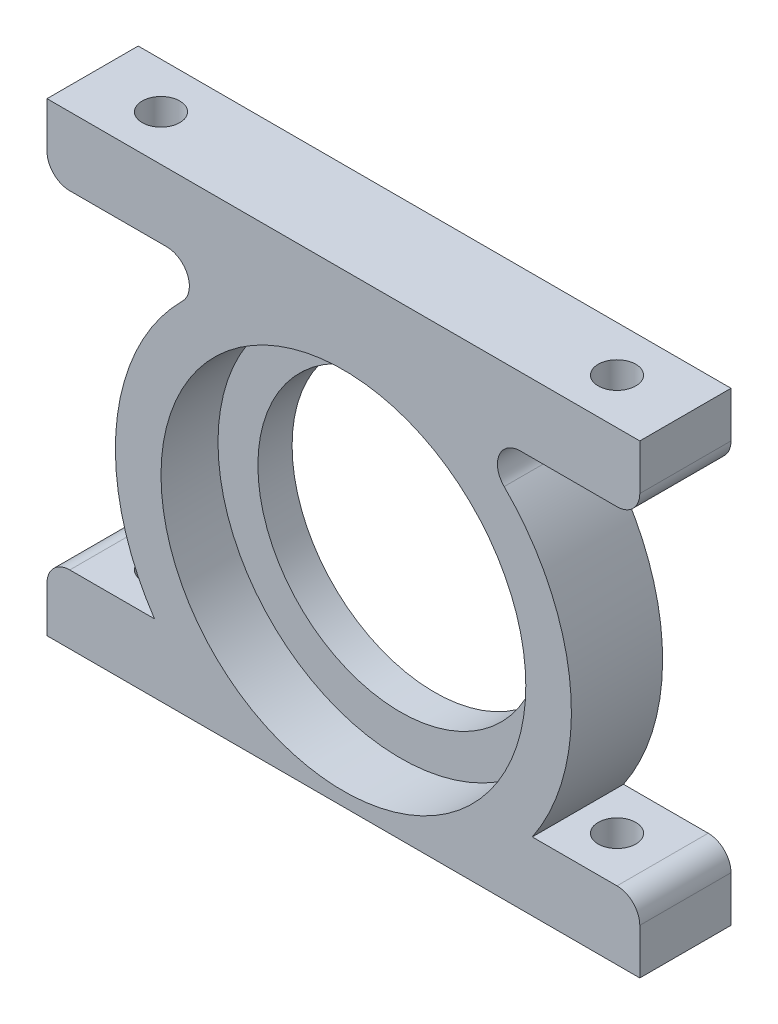
ISO-10303-21;
HEADER;
FILE_DESCRIPTION(('STEP AP214'),'2;1');
FILE_NAME('part.step','',(''),(''),'','','');
FILE_SCHEMA(('AUTOMOTIVE_DESIGN { 1 0 10303 214 1 1 1 1 }'));
ENDSEC;
DATA;
#1=APPLICATION_CONTEXT('core data for automotive mechanical design processes');
#2=APPLICATION_PROTOCOL_DEFINITION('international standard','automotive_design',2000,#1);
#3=PRODUCT_CONTEXT('',#1,'mechanical');
#4=PRODUCT('Part','Part','',(#3));
#5=PRODUCT_RELATED_PRODUCT_CATEGORY('part','',(#4));
#6=PRODUCT_DEFINITION_FORMATION('','',#4);
#7=PRODUCT_DEFINITION_CONTEXT('part definition',#1,'design');
#8=PRODUCT_DEFINITION('design','',#6,#7);
#9=PRODUCT_DEFINITION_SHAPE('','',#8);
#10=(LENGTH_UNIT() NAMED_UNIT(*) SI_UNIT(.MILLI.,.METRE.));
#11=(NAMED_UNIT(*) PLANE_ANGLE_UNIT() SI_UNIT($,.RADIAN.));
#12=(NAMED_UNIT(*) SI_UNIT($,.STERADIAN.) SOLID_ANGLE_UNIT());
#13=UNCERTAINTY_MEASURE_WITH_UNIT(LENGTH_MEASURE(1.E-05),#10,'distance_accuracy_value','');
#14=(GEOMETRIC_REPRESENTATION_CONTEXT(3) GLOBAL_UNCERTAINTY_ASSIGNED_CONTEXT((#13)) GLOBAL_UNIT_ASSIGNED_CONTEXT((#10,
#11,#12)) REPRESENTATION_CONTEXT('',''));
#15=CARTESIAN_POINT('',(0.,0.,0.));
#16=DIRECTION('',(0.,0.,1.));
#17=DIRECTION('',(1.,0.,0.));
#18=AXIS2_PLACEMENT_3D('',#15,#16,#17);
#19=CARTESIAN_POINT('',(-26.,23.6,8.));
#20=DIRECTION('',(0.,-1.,0.));
#21=DIRECTION('',(0.,0.,-1.));
#22=AXIS2_PLACEMENT_3D('',#19,#20,#21);
#23=PLANE('',#22);
#24=DIRECTION('',(-1.,0.,0.));
#25=VECTOR('',#24,1.);
#26=CARTESIAN_POINT('',(-26.,23.6,0.));
#27=LINE('',#26,#25);
#28=CARTESIAN_POINT('',(26.,23.6,0.));
#29=VERTEX_POINT('',#28);
#30=CARTESIAN_POINT('',(-26.,23.6,0.));
#31=VERTEX_POINT('',#30);
#32=EDGE_CURVE('E233',#29,#31,#27,.T.);
#33=ORIENTED_EDGE('',*,*,#32,.T.);
#34=DIRECTION('',(0.,0.,-1.));
#35=VECTOR('',#34,1.);
#36=CARTESIAN_POINT('',(-26.,23.6,8.));
#37=LINE('',#36,#35);
#38=CARTESIAN_POINT('',(-26.,23.6,8.));
#39=VERTEX_POINT('',#38);
#40=EDGE_CURVE('E253',#39,#31,#37,.T.);
#41=ORIENTED_EDGE('',*,*,#40,.F.);
#42=DIRECTION('',(-1.,0.,0.));
#43=VECTOR('',#42,1.);
#44=CARTESIAN_POINT('',(-26.,23.6,8.));
#45=LINE('',#44,#43);
#46=CARTESIAN_POINT('',(26.,23.6,8.));
#47=VERTEX_POINT('',#46);
#48=EDGE_CURVE('E204',#47,#39,#45,.T.);
#49=ORIENTED_EDGE('',*,*,#48,.F.);
#50=DIRECTION('',(0.,0.,-1.));
#51=VECTOR('',#50,1.);
#52=CARTESIAN_POINT('',(26.,23.6,8.));
#53=LINE('',#52,#51);
#54=EDGE_CURVE('E188',#47,#29,#53,.T.);
#55=ORIENTED_EDGE('',*,*,#54,.T.);
#56=EDGE_LOOP('',(#33,#41,#49,#55));
#57=FACE_BOUND('',#56,.T.);
#58=CARTESIAN_POINT('',(20.,23.6,3.99999999999997));
#59=DIRECTION('',(0.,1.,0.));
#60=DIRECTION('',(0.,0.,1.));
#61=AXIS2_PLACEMENT_3D('',#58,#59,#60);
#62=CIRCLE('',#61,1.64999999999999);
#63=CARTESIAN_POINT('',(20.,23.6,5.64999999999995));
#64=VERTEX_POINT('',#63);
#65=EDGE_CURVE('E354',#64,#64,#62,.T.);
#66=ORIENTED_EDGE('',*,*,#65,.F.);
#67=EDGE_LOOP('',(#66));
#68=FACE_BOUND('',#67,.T.);
#69=CARTESIAN_POINT('',(-20.,23.6,4.));
#70=DIRECTION('',(0.,1.,0.));
#71=DIRECTION('',(0.,0.,1.));
#72=AXIS2_PLACEMENT_3D('',#69,#70,#71);
#73=CIRCLE('',#72,1.64999999999999);
#74=CARTESIAN_POINT('',(-20.,23.6,5.64999999999999));
#75=VERTEX_POINT('',#74);
#76=EDGE_CURVE('E363',#75,#75,#73,.T.);
#77=ORIENTED_EDGE('',*,*,#76,.F.);
#78=EDGE_LOOP('',(#77));
#79=FACE_BOUND('',#78,.T.);
#80=ADVANCED_FACE('F37',(#57,#68,#79),#23,.F.);
#81=CARTESIAN_POINT('',(0.,0.,8.));
#82=DIRECTION('',(0.,0.,-1.));
#83=DIRECTION('',(-1.,0.,0.));
#84=AXIS2_PLACEMENT_3D('',#81,#82,#83);
#85=CYLINDRICAL_SURFACE('',#84,16.);
#86=CARTESIAN_POINT('',(0.,0.,8.));
#87=DIRECTION('',(0.,0.,1.));
#88=DIRECTION('',(1.,0.,0.));
#89=AXIS2_PLACEMENT_3D('',#86,#87,#88);
#90=CIRCLE('',#89,16.);
#91=CARTESIAN_POINT('',(16.,0.,8.));
#92=VERTEX_POINT('',#91);
#93=EDGE_CURVE('E225',#92,#92,#90,.T.);
#94=ORIENTED_EDGE('',*,*,#93,.T.);
#95=EDGE_LOOP('',(#94));
#96=FACE_BOUND('',#95,.T.);
#97=CARTESIAN_POINT('',(0.,0.,3.));
#98=DIRECTION('',(0.,0.,-1.));
#99=DIRECTION('',(-1.,0.,0.));
#100=AXIS2_PLACEMENT_3D('',#97,#98,#99);
#101=CIRCLE('',#100,16.);
#102=CARTESIAN_POINT('',(-16.,0.,3.));
#103=VERTEX_POINT('',#102);
#104=EDGE_CURVE('E344',#103,#103,#101,.T.);
#105=ORIENTED_EDGE('',*,*,#104,.T.);
#106=EDGE_LOOP('',(#105));
#107=FACE_BOUND('',#106,.T.);
#108=ADVANCED_FACE('F405',(#96,#107),#85,.F.);
#109=CARTESIAN_POINT('',(0.,0.,8.));
#110=DIRECTION('',(0.,0.,1.));
#111=DIRECTION('',(1.,0.,0.));
#112=AXIS2_PLACEMENT_3D('',#109,#110,#111);
#113=PLANE('',#112);
#114=DIRECTION('',(1.,0.,0.));
#115=VECTOR('',#114,1.);
#116=CARTESIAN_POINT('',(26.,17.6,8.));
#117=LINE('',#116,#115);
#118=CARTESIAN_POINT('',(15.5125755437322,17.6,8.));
#119=VERTEX_POINT('',#118);
#120=CARTESIAN_POINT('',(24.,17.6,8.));
#121=VERTEX_POINT('',#120);
#122=EDGE_CURVE('E193',#119,#121,#117,.T.);
#123=ORIENTED_EDGE('',*,*,#122,.T.);
#124=CARTESIAN_POINT('',(24.,19.6,8.));
#125=DIRECTION('',(0.,0.,1.));
#126=DIRECTION('',(1.,0.,0.));
#127=AXIS2_PLACEMENT_3D('',#124,#125,#126);
#128=CIRCLE('',#127,2.);
#129=CARTESIAN_POINT('',(26.,19.6,8.));
#130=VERTEX_POINT('',#129);
#131=EDGE_CURVE('E276',#121,#130,#128,.T.);
#132=ORIENTED_EDGE('',*,*,#131,.T.);
#133=DIRECTION('',(0.,1.,0.));
#134=VECTOR('',#133,1.);
#135=CARTESIAN_POINT('',(26.,23.6,8.));
#136=LINE('',#135,#134);
#137=EDGE_CURVE('E200',#130,#47,#136,.T.);
#138=ORIENTED_EDGE('',*,*,#137,.T.);
#139=ORIENTED_EDGE('',*,*,#48,.T.);
#140=DIRECTION('',(0.,-1.,0.));
#141=VECTOR('',#140,1.);
#142=CARTESIAN_POINT('',(-26.,23.6,8.));
#143=LINE('',#142,#141);
#144=CARTESIAN_POINT('',(-26.,19.6,8.));
#145=VERTEX_POINT('',#144);
#146=EDGE_CURVE('E201',#39,#145,#143,.T.);
#147=ORIENTED_EDGE('',*,*,#146,.T.);
#148=CARTESIAN_POINT('',(-24.,19.6,8.));
#149=DIRECTION('',(0.,0.,1.));
#150=DIRECTION('',(1.,0.,0.));
#151=AXIS2_PLACEMENT_3D('',#148,#149,#150);
#152=CIRCLE('',#151,2.);
#153=CARTESIAN_POINT('',(-24.,17.6,8.));
#154=VERTEX_POINT('',#153);
#155=EDGE_CURVE('E280',#145,#154,#152,.T.);
#156=ORIENTED_EDGE('',*,*,#155,.T.);
#157=DIRECTION('',(1.,0.,0.));
#158=VECTOR('',#157,1.);
#159=CARTESIAN_POINT('',(-26.,17.6,8.));
#160=LINE('',#159,#158);
#161=CARTESIAN_POINT('',(-15.5125755437322,17.6,8.));
#162=VERTEX_POINT('',#161);
#163=EDGE_CURVE('E210',#154,#162,#160,.T.);
#164=ORIENTED_EDGE('',*,*,#163,.T.);
#165=CARTESIAN_POINT('',(-15.5125755437322,15.6,8.));
#166=DIRECTION('',(0.,0.,1.));
#167=DIRECTION('',(1.,0.,0.));
#168=AXIS2_PLACEMENT_3D('',#165,#166,#167);
#169=CIRCLE('',#168,2.);
#170=CARTESIAN_POINT('',(-14.102341403393,14.1818181818182,8.));
#171=VERTEX_POINT('',#170);
#172=EDGE_CURVE('E11',#162,#171,#169,.F.);
#173=ORIENTED_EDGE('',*,*,#172,.T.);
#174=CARTESIAN_POINT('',(0.,0.,8.));
#175=DIRECTION('',(0.,0.,1.));
#176=DIRECTION('',(1.,0.,0.));
#177=AXIS2_PLACEMENT_3D('',#174,#175,#176);
#178=CIRCLE('',#177,20.);
#179=CARTESIAN_POINT('',(-16.5698521417664,-11.2,8.));
#180=VERTEX_POINT('',#179);
#181=EDGE_CURVE('E208',#171,#180,#178,.T.);
#182=ORIENTED_EDGE('',*,*,#181,.T.);
#183=DIRECTION('',(-1.,0.,0.));
#184=VECTOR('',#183,1.);
#185=CARTESIAN_POINT('',(-26.,-11.2,8.));
#186=LINE('',#185,#184);
#187=CARTESIAN_POINT('',(-24.,-11.2,8.));
#188=VERTEX_POINT('',#187);
#189=EDGE_CURVE('E215',#180,#188,#186,.T.);
#190=ORIENTED_EDGE('',*,*,#189,.T.);
#191=CARTESIAN_POINT('',(-24.,-13.2,8.));
#192=DIRECTION('',(0.,0.,1.));
#193=DIRECTION('',(1.,0.,0.));
#194=AXIS2_PLACEMENT_3D('',#191,#192,#193);
#195=CIRCLE('',#194,2.);
#196=CARTESIAN_POINT('',(-26.,-13.2,8.));
#197=VERTEX_POINT('',#196);
#198=EDGE_CURVE('E54',#188,#197,#195,.T.);
#199=ORIENTED_EDGE('',*,*,#198,.T.);
#200=DIRECTION('',(0.,-1.,0.));
#201=VECTOR('',#200,1.);
#202=CARTESIAN_POINT('',(-26.,-17.2,8.));
#203=LINE('',#202,#201);
#204=CARTESIAN_POINT('',(-26.,-17.2,8.));
#205=VERTEX_POINT('',#204);
#206=EDGE_CURVE('E211',#197,#205,#203,.T.);
#207=ORIENTED_EDGE('',*,*,#206,.T.);
#208=DIRECTION('',(1.,0.,0.));
#209=VECTOR('',#208,1.);
#210=CARTESIAN_POINT('',(-26.,-17.2,8.));
#211=LINE('',#210,#209);
#212=CARTESIAN_POINT('',(26.,-17.2,8.));
#213=VERTEX_POINT('',#212);
#214=EDGE_CURVE('E217',#205,#213,#211,.T.);
#215=ORIENTED_EDGE('',*,*,#214,.T.);
#216=DIRECTION('',(0.,1.,0.));
#217=VECTOR('',#216,1.);
#218=CARTESIAN_POINT('',(26.,-17.2,8.));
#219=LINE('',#218,#217);
#220=CARTESIAN_POINT('',(26.,-13.2,8.));
#221=VERTEX_POINT('',#220);
#222=EDGE_CURVE('E177',#213,#221,#219,.T.);
#223=ORIENTED_EDGE('',*,*,#222,.T.);
#224=CARTESIAN_POINT('',(24.,-13.2,8.));
#225=DIRECTION('',(0.,0.,1.));
#226=DIRECTION('',(1.,0.,0.));
#227=AXIS2_PLACEMENT_3D('',#224,#225,#226);
#228=CIRCLE('',#227,2.);
#229=CARTESIAN_POINT('',(24.,-11.2,8.));
#230=VERTEX_POINT('',#229);
#231=EDGE_CURVE('E174',#221,#230,#228,.T.);
#232=ORIENTED_EDGE('',*,*,#231,.T.);
#233=DIRECTION('',(-1.,0.,0.));
#234=VECTOR('',#233,1.);
#235=CARTESIAN_POINT('',(26.,-11.2,8.));
#236=LINE('',#235,#234);
#237=CARTESIAN_POINT('',(16.5698521417664,-11.2,8.));
#238=VERTEX_POINT('',#237);
#239=EDGE_CURVE('E164',#230,#238,#236,.T.);
#240=ORIENTED_EDGE('',*,*,#239,.T.);
#241=CARTESIAN_POINT('',(0.,0.,8.));
#242=DIRECTION('',(0.,0.,1.));
#243=DIRECTION('',(1.,0.,0.));
#244=AXIS2_PLACEMENT_3D('',#241,#242,#243);
#245=CIRCLE('',#244,20.);
#246=CARTESIAN_POINT('',(14.102341403393,14.1818181818182,8.));
#247=VERTEX_POINT('',#246);
#248=EDGE_CURVE('E171',#238,#247,#245,.T.);
#249=ORIENTED_EDGE('',*,*,#248,.T.);
#250=CARTESIAN_POINT('',(15.5125755437322,15.6,8.));
#251=DIRECTION('',(0.,0.,1.));
#252=DIRECTION('',(1.,0.,0.));
#253=AXIS2_PLACEMENT_3D('',#250,#251,#252);
#254=CIRCLE('',#253,2.);
#255=EDGE_CURVE('E305',#247,#119,#254,.F.);
#256=ORIENTED_EDGE('',*,*,#255,.T.);
#257=EDGE_LOOP('',(#123,#132,#138,#139,#147,#156,#164,#173,#182,#190,#199,#207,#215,#223,#232,
#240,#249,#256));
#258=FACE_BOUND('',#257,.T.);
#259=ORIENTED_EDGE('',*,*,#93,.F.);
#260=EDGE_LOOP('',(#259));
#261=FACE_BOUND('',#260,.T.);
#262=ADVANCED_FACE('F166',(#258,#261),#113,.T.);
#263=CARTESIAN_POINT('',(0.,0.,0.));
#264=DIRECTION('',(0.,0.,1.));
#265=DIRECTION('',(1.,0.,0.));
#266=AXIS2_PLACEMENT_3D('',#263,#264,#265);
#267=PLANE('',#266);
#268=DIRECTION('',(0.,1.,0.));
#269=VECTOR('',#268,1.);
#270=CARTESIAN_POINT('',(26.,23.6,0.));
#271=LINE('',#270,#269);
#272=CARTESIAN_POINT('',(26.,19.6,0.));
#273=VERTEX_POINT('',#272);
#274=EDGE_CURVE('E230',#273,#29,#271,.T.);
#275=ORIENTED_EDGE('',*,*,#274,.F.);
#276=CARTESIAN_POINT('',(24.,19.6,0.));
#277=DIRECTION('',(0.,0.,1.));
#278=DIRECTION('',(1.,0.,0.));
#279=AXIS2_PLACEMENT_3D('',#276,#277,#278);
#280=CIRCLE('',#279,2.);
#281=CARTESIAN_POINT('',(24.,17.6,0.));
#282=VERTEX_POINT('',#281);
#283=EDGE_CURVE('E270',#273,#282,#280,.F.);
#284=ORIENTED_EDGE('',*,*,#283,.T.);
#285=DIRECTION('',(1.,0.,0.));
#286=VECTOR('',#285,1.);
#287=CARTESIAN_POINT('',(26.,17.6,0.));
#288=LINE('',#287,#286);
#289=CARTESIAN_POINT('',(15.5125755437322,17.6,0.));
#290=VERTEX_POINT('',#289);
#291=EDGE_CURVE('E228',#290,#282,#288,.T.);
#292=ORIENTED_EDGE('',*,*,#291,.F.);
#293=CARTESIAN_POINT('',(15.5125755437322,15.6,0.));
#294=DIRECTION('',(0.,0.,1.));
#295=DIRECTION('',(1.,0.,0.));
#296=AXIS2_PLACEMENT_3D('',#293,#294,#295);
#297=CIRCLE('',#296,2.);
#298=CARTESIAN_POINT('',(14.102341403393,14.1818181818182,0.));
#299=VERTEX_POINT('',#298);
#300=EDGE_CURVE('E297',#290,#299,#297,.T.);
#301=ORIENTED_EDGE('',*,*,#300,.T.);
#302=CARTESIAN_POINT('',(0.,0.,0.));
#303=DIRECTION('',(0.,0.,1.));
#304=DIRECTION('',(1.,0.,0.));
#305=AXIS2_PLACEMENT_3D('',#302,#303,#304);
#306=CIRCLE('',#305,20.);
#307=CARTESIAN_POINT('',(16.5698521417664,-11.2,0.));
#308=VERTEX_POINT('',#307);
#309=EDGE_CURVE('E222',#308,#299,#306,.T.);
#310=ORIENTED_EDGE('',*,*,#309,.F.);
#311=DIRECTION('',(-1.,0.,0.));
#312=VECTOR('',#311,1.);
#313=CARTESIAN_POINT('',(26.,-11.2,0.));
#314=LINE('',#313,#312);
#315=CARTESIAN_POINT('',(24.,-11.2,0.));
#316=VERTEX_POINT('',#315);
#317=EDGE_CURVE('E184',#316,#308,#314,.T.);
#318=ORIENTED_EDGE('',*,*,#317,.F.);
#319=CARTESIAN_POINT('',(24.,-13.2,0.));
#320=DIRECTION('',(0.,0.,1.));
#321=DIRECTION('',(1.,0.,0.));
#322=AXIS2_PLACEMENT_3D('',#319,#320,#321);
#323=CIRCLE('',#322,2.);
#324=CARTESIAN_POINT('',(26.,-13.2,0.));
#325=VERTEX_POINT('',#324);
#326=EDGE_CURVE('E265',#316,#325,#323,.F.);
#327=ORIENTED_EDGE('',*,*,#326,.T.);
#328=DIRECTION('',(0.,1.,0.));
#329=VECTOR('',#328,1.);
#330=CARTESIAN_POINT('',(26.,-17.2,0.));
#331=LINE('',#330,#329);
#332=CARTESIAN_POINT('',(26.,-17.2,0.));
#333=VERTEX_POINT('',#332);
#334=EDGE_CURVE('E216',#333,#325,#331,.T.);
#335=ORIENTED_EDGE('',*,*,#334,.F.);
#336=DIRECTION('',(1.,0.,0.));
#337=VECTOR('',#336,1.);
#338=CARTESIAN_POINT('',(-26.,-17.2,0.));
#339=LINE('',#338,#337);
#340=CARTESIAN_POINT('',(-26.,-17.2,0.));
#341=VERTEX_POINT('',#340);
#342=EDGE_CURVE('E244',#341,#333,#339,.T.);
#343=ORIENTED_EDGE('',*,*,#342,.F.);
#344=DIRECTION('',(0.,-1.,0.));
#345=VECTOR('',#344,1.);
#346=CARTESIAN_POINT('',(-26.,-17.2,0.));
#347=LINE('',#346,#345);
#348=CARTESIAN_POINT('',(-26.,-13.2,0.));
#349=VERTEX_POINT('',#348);
#350=EDGE_CURVE('E243',#349,#341,#347,.T.);
#351=ORIENTED_EDGE('',*,*,#350,.F.);
#352=CARTESIAN_POINT('',(-24.,-13.2,0.));
#353=DIRECTION('',(0.,0.,1.));
#354=DIRECTION('',(1.,0.,0.));
#355=AXIS2_PLACEMENT_3D('',#352,#353,#354);
#356=CIRCLE('',#355,2.);
#357=CARTESIAN_POINT('',(-24.,-11.2,0.));
#358=VERTEX_POINT('',#357);
#359=EDGE_CURVE('E262',#349,#358,#356,.F.);
#360=ORIENTED_EDGE('',*,*,#359,.T.);
#361=DIRECTION('',(-1.,0.,0.));
#362=VECTOR('',#361,1.);
#363=CARTESIAN_POINT('',(-26.,-11.2,0.));
#364=LINE('',#363,#362);
#365=CARTESIAN_POINT('',(-16.5698521417664,-11.2,0.));
#366=VERTEX_POINT('',#365);
#367=EDGE_CURVE('E241',#366,#358,#364,.T.);
#368=ORIENTED_EDGE('',*,*,#367,.F.);
#369=CARTESIAN_POINT('',(0.,0.,0.));
#370=DIRECTION('',(0.,0.,1.));
#371=DIRECTION('',(1.,0.,0.));
#372=AXIS2_PLACEMENT_3D('',#369,#370,#371);
#373=CIRCLE('',#372,20.);
#374=CARTESIAN_POINT('',(-14.102341403393,14.1818181818182,0.));
#375=VERTEX_POINT('',#374);
#376=EDGE_CURVE('E237',#375,#366,#373,.T.);
#377=ORIENTED_EDGE('',*,*,#376,.F.);
#378=CARTESIAN_POINT('',(-15.5125755437322,15.6,0.));
#379=DIRECTION('',(0.,0.,1.));
#380=DIRECTION('',(1.,0.,0.));
#381=AXIS2_PLACEMENT_3D('',#378,#379,#380);
#382=CIRCLE('',#381,2.);
#383=CARTESIAN_POINT('',(-15.5125755437322,17.6,0.));
#384=VERTEX_POINT('',#383);
#385=EDGE_CURVE('E48',#375,#384,#382,.T.);
#386=ORIENTED_EDGE('',*,*,#385,.T.);
#387=DIRECTION('',(1.,0.,0.));
#388=VECTOR('',#387,1.);
#389=CARTESIAN_POINT('',(-26.,17.6,0.));
#390=LINE('',#389,#388);
#391=CARTESIAN_POINT('',(-24.,17.6,0.));
#392=VERTEX_POINT('',#391);
#393=EDGE_CURVE('E236',#392,#384,#390,.T.);
#394=ORIENTED_EDGE('',*,*,#393,.F.);
#395=CARTESIAN_POINT('',(-24.,19.6,0.));
#396=DIRECTION('',(0.,0.,1.));
#397=DIRECTION('',(1.,0.,0.));
#398=AXIS2_PLACEMENT_3D('',#395,#396,#397);
#399=CIRCLE('',#398,2.);
#400=CARTESIAN_POINT('',(-26.,19.6,0.));
#401=VERTEX_POINT('',#400);
#402=EDGE_CURVE('E267',#392,#401,#399,.F.);
#403=ORIENTED_EDGE('',*,*,#402,.T.);
#404=DIRECTION('',(0.,-1.,0.));
#405=VECTOR('',#404,1.);
#406=CARTESIAN_POINT('',(-26.,23.6,0.));
#407=LINE('',#406,#405);
#408=EDGE_CURVE('E231',#31,#401,#407,.T.);
#409=ORIENTED_EDGE('',*,*,#408,.F.);
#410=ORIENTED_EDGE('',*,*,#32,.F.);
#411=EDGE_LOOP('',(#275,#284,#292,#301,#310,#318,#327,#335,#343,#351,#360,#368,#377,#386,#394,
#403,#409,#410));
#412=FACE_BOUND('',#411,.T.);
#413=CARTESIAN_POINT('',(0.,0.,0.));
#414=DIRECTION('',(0.,0.,-1.));
#415=DIRECTION('',(-1.,0.,0.));
#416=AXIS2_PLACEMENT_3D('',#413,#414,#415);
#417=CIRCLE('',#416,12.5);
#418=CARTESIAN_POINT('',(-12.5,0.,0.));
#419=VERTEX_POINT('',#418);
#420=EDGE_CURVE('E349',#419,#419,#417,.T.);
#421=ORIENTED_EDGE('',*,*,#420,.F.);
#422=EDGE_LOOP('',(#421));
#423=FACE_BOUND('',#422,.T.);
#424=ADVANCED_FACE('F310',(#412,#423),#267,.F.);
#425=CARTESIAN_POINT('',(26.,-17.2,8.));
#426=DIRECTION('',(-1.,0.,0.));
#427=DIRECTION('',(0.,-1.,0.));
#428=AXIS2_PLACEMENT_3D('',#425,#426,#427);
#429=PLANE('',#428);
#430=ORIENTED_EDGE('',*,*,#334,.T.);
#431=DIRECTION('',(0.,0.,-1.));
#432=VECTOR('',#431,1.);
#433=CARTESIAN_POINT('',(26.,-13.2,8.));
#434=LINE('',#433,#432);
#435=EDGE_CURVE('E295',#325,#221,#434,.F.);
#436=ORIENTED_EDGE('',*,*,#435,.T.);
#437=ORIENTED_EDGE('',*,*,#222,.F.);
#438=DIRECTION('',(0.,0.,-1.));
#439=VECTOR('',#438,1.);
#440=CARTESIAN_POINT('',(26.,-17.2,8.));
#441=LINE('',#440,#439);
#442=EDGE_CURVE('E220',#213,#333,#441,.T.);
#443=ORIENTED_EDGE('',*,*,#442,.T.);
#444=EDGE_LOOP('',(#430,#436,#437,#443));
#445=FACE_BOUND('',#444,.T.);
#446=ADVANCED_FACE('F336',(#445),#429,.F.);
#447=CARTESIAN_POINT('',(26.,-11.2,8.));
#448=DIRECTION('',(0.,-1.,0.));
#449=DIRECTION('',(0.,0.,-1.));
#450=AXIS2_PLACEMENT_3D('',#447,#448,#449);
#451=PLANE('',#450);
#452=CARTESIAN_POINT('',(20.,-11.2,3.99999999999997));
#453=DIRECTION('',(0.,-1.,0.));
#454=DIRECTION('',(0.,0.,-1.));
#455=AXIS2_PLACEMENT_3D('',#452,#453,#454);
#456=CIRCLE('',#455,1.64999999999999);
#457=CARTESIAN_POINT('',(20.,-11.2,2.34999999999997));
#458=VERTEX_POINT('',#457);
#459=EDGE_CURVE('E369',#458,#458,#456,.T.);
#460=ORIENTED_EDGE('',*,*,#459,.T.);
#461=EDGE_LOOP('',(#460));
#462=FACE_BOUND('',#461,.T.);
#463=ORIENTED_EDGE('',*,*,#239,.F.);
#464=DIRECTION('',(0.,0.,-1.));
#465=VECTOR('',#464,1.);
#466=CARTESIAN_POINT('',(24.,-11.2,8.));
#467=LINE('',#466,#465);
#468=EDGE_CURVE('E292',#230,#316,#467,.T.);
#469=ORIENTED_EDGE('',*,*,#468,.T.);
#470=ORIENTED_EDGE('',*,*,#317,.T.);
#471=DIRECTION('',(0.,0.,-1.));
#472=VECTOR('',#471,1.);
#473=CARTESIAN_POINT('',(16.5698521417664,-11.2,8.));
#474=LINE('',#473,#472);
#475=EDGE_CURVE('E185',#238,#308,#474,.T.);
#476=ORIENTED_EDGE('',*,*,#475,.F.);
#477=EDGE_LOOP('',(#463,#469,#470,#476));
#478=FACE_BOUND('',#477,.T.);
#479=ADVANCED_FACE('F182',(#462,#478),#451,.F.);
#480=CARTESIAN_POINT('',(0.,0.,8.));
#481=DIRECTION('',(0.,0.,-1.));
#482=DIRECTION('',(-1.,0.,0.));
#483=AXIS2_PLACEMENT_3D('',#480,#481,#482);
#484=CYLINDRICAL_SURFACE('',#483,20.);
#485=ORIENTED_EDGE('',*,*,#309,.T.);
#486=DIRECTION('',(0.,0.,-1.));
#487=VECTOR('',#486,1.);
#488=CARTESIAN_POINT('',(14.102341403393,14.1818181818182,8.));
#489=LINE('',#488,#487);
#490=EDGE_CURVE('E191',#299,#247,#489,.F.);
#491=ORIENTED_EDGE('',*,*,#490,.T.);
#492=ORIENTED_EDGE('',*,*,#248,.F.);
#493=ORIENTED_EDGE('',*,*,#475,.T.);
#494=EDGE_LOOP('',(#485,#491,#492,#493));
#495=FACE_BOUND('',#494,.T.);
#496=ADVANCED_FACE('F195',(#495),#484,.T.);
#497=CARTESIAN_POINT('',(26.,17.6,8.));
#498=DIRECTION('',(0.,1.,0.));
#499=DIRECTION('',(-1.,0.,0.));
#500=AXIS2_PLACEMENT_3D('',#497,#498,#499);
#501=PLANE('',#500);
#502=CARTESIAN_POINT('',(20.,17.6,3.99999999999997));
#503=DIRECTION('',(0.,1.,0.));
#504=DIRECTION('',(-1.,0.,0.));
#505=AXIS2_PLACEMENT_3D('',#502,#503,#504);
#506=CIRCLE('',#505,1.64999999999999);
#507=CARTESIAN_POINT('',(18.35,17.6,3.99999999999997));
#508=VERTEX_POINT('',#507);
#509=EDGE_CURVE('E348',#508,#508,#506,.T.);
#510=ORIENTED_EDGE('',*,*,#509,.T.);
#511=EDGE_LOOP('',(#510));
#512=FACE_BOUND('',#511,.T.);
#513=ORIENTED_EDGE('',*,*,#291,.T.);
#514=DIRECTION('',(0.,0.,-1.));
#515=VECTOR('',#514,1.);
#516=CARTESIAN_POINT('',(24.,17.6,8.));
#517=LINE('',#516,#515);
#518=EDGE_CURVE('E271',#282,#121,#517,.F.);
#519=ORIENTED_EDGE('',*,*,#518,.T.);
#520=ORIENTED_EDGE('',*,*,#122,.F.);
#521=DIRECTION('',(0.,0.,1.));
#522=VECTOR('',#521,1.);
#523=CARTESIAN_POINT('',(15.5125755437322,17.6,0.));
#524=LINE('',#523,#522);
#525=EDGE_CURVE('E268',#119,#290,#524,.F.);
#526=ORIENTED_EDGE('',*,*,#525,.T.);
#527=EDGE_LOOP('',(#513,#519,#520,#526));
#528=FACE_BOUND('',#527,.T.);
#529=ADVANCED_FACE('F419',(#512,#528),#501,.F.);
#530=CARTESIAN_POINT('',(26.,23.6,8.));
#531=DIRECTION('',(-1.,0.,0.));
#532=DIRECTION('',(0.,0.,1.));
#533=AXIS2_PLACEMENT_3D('',#530,#531,#532);
#534=PLANE('',#533);
#535=ORIENTED_EDGE('',*,*,#137,.F.);
#536=DIRECTION('',(0.,0.,-1.));
#537=VECTOR('',#536,1.);
#538=CARTESIAN_POINT('',(26.,19.6,8.));
#539=LINE('',#538,#537);
#540=EDGE_CURVE('E186',#130,#273,#539,.T.);
#541=ORIENTED_EDGE('',*,*,#540,.T.);
#542=ORIENTED_EDGE('',*,*,#274,.T.);
#543=ORIENTED_EDGE('',*,*,#54,.F.);
#544=EDGE_LOOP('',(#535,#541,#542,#543));
#545=FACE_BOUND('',#544,.T.);
#546=ADVANCED_FACE('F420',(#545),#534,.F.);
#547=CARTESIAN_POINT('',(-26.,23.6,8.));
#548=DIRECTION('',(1.,0.,0.));
#549=DIRECTION('',(0.,0.,-1.));
#550=AXIS2_PLACEMENT_3D('',#547,#548,#549);
#551=PLANE('',#550);
#552=ORIENTED_EDGE('',*,*,#408,.T.);
#553=DIRECTION('',(0.,0.,-1.));
#554=VECTOR('',#553,1.);
#555=CARTESIAN_POINT('',(-26.,19.6,8.));
#556=LINE('',#555,#554);
#557=EDGE_CURVE('E288',#401,#145,#556,.F.);
#558=ORIENTED_EDGE('',*,*,#557,.T.);
#559=ORIENTED_EDGE('',*,*,#146,.F.);
#560=ORIENTED_EDGE('',*,*,#40,.T.);
#561=EDGE_LOOP('',(#552,#558,#559,#560));
#562=FACE_BOUND('',#561,.T.);
#563=ADVANCED_FACE('F413',(#562),#551,.F.);
#564=CARTESIAN_POINT('',(-26.,17.6,8.));
#565=DIRECTION('',(0.,1.,0.));
#566=DIRECTION('',(0.,0.,1.));
#567=AXIS2_PLACEMENT_3D('',#564,#565,#566);
#568=PLANE('',#567);
#569=CARTESIAN_POINT('',(-20.,17.6,4.));
#570=DIRECTION('',(0.,1.,0.));
#571=DIRECTION('',(0.,0.,1.));
#572=AXIS2_PLACEMENT_3D('',#569,#570,#571);
#573=CIRCLE('',#572,1.64999999999999);
#574=CARTESIAN_POINT('',(-20.,17.6,5.64999999999999));
#575=VERTEX_POINT('',#574);
#576=EDGE_CURVE('E356',#575,#575,#573,.T.);
#577=ORIENTED_EDGE('',*,*,#576,.T.);
#578=EDGE_LOOP('',(#577));
#579=FACE_BOUND('',#578,.T.);
#580=ORIENTED_EDGE('',*,*,#163,.F.);
#581=DIRECTION('',(0.,0.,-1.));
#582=VECTOR('',#581,1.);
#583=CARTESIAN_POINT('',(-24.,17.6,8.));
#584=LINE('',#583,#582);
#585=EDGE_CURVE('E285',#154,#392,#584,.T.);
#586=ORIENTED_EDGE('',*,*,#585,.T.);
#587=ORIENTED_EDGE('',*,*,#393,.T.);
#588=DIRECTION('',(0.,0.,1.));
#589=VECTOR('',#588,1.);
#590=CARTESIAN_POINT('',(-15.5125755437322,17.6,8.));
#591=LINE('',#590,#589);
#592=EDGE_CURVE('E282',#384,#162,#591,.T.);
#593=ORIENTED_EDGE('',*,*,#592,.T.);
#594=EDGE_LOOP('',(#580,#586,#587,#593));
#595=FACE_BOUND('',#594,.T.);
#596=ADVANCED_FACE('F314',(#579,#595),#568,.F.);
#597=CARTESIAN_POINT('',(0.,0.,8.));
#598=DIRECTION('',(0.,0.,-1.));
#599=DIRECTION('',(-1.,0.,0.));
#600=AXIS2_PLACEMENT_3D('',#597,#598,#599);
#601=CYLINDRICAL_SURFACE('',#600,20.);
#602=ORIENTED_EDGE('',*,*,#181,.F.);
#603=DIRECTION('',(0.,0.,-1.));
#604=VECTOR('',#603,1.);
#605=CARTESIAN_POINT('',(-14.102341403393,14.1818181818182,8.));
#606=LINE('',#605,#604);
#607=EDGE_CURVE('E300',#171,#375,#606,.T.);
#608=ORIENTED_EDGE('',*,*,#607,.T.);
#609=ORIENTED_EDGE('',*,*,#376,.T.);
#610=DIRECTION('',(0.,0.,-1.));
#611=VECTOR('',#610,1.);
#612=CARTESIAN_POINT('',(-16.5698521417664,-11.2,8.));
#613=LINE('',#612,#611);
#614=EDGE_CURVE('E255',#180,#366,#613,.T.);
#615=ORIENTED_EDGE('',*,*,#614,.F.);
#616=EDGE_LOOP('',(#602,#608,#609,#615));
#617=FACE_BOUND('',#616,.T.);
#618=ADVANCED_FACE('F322',(#617),#601,.T.);
#619=CARTESIAN_POINT('',(-26.,-11.2,8.));
#620=DIRECTION('',(0.,-1.,0.));
#621=DIRECTION('',(0.,0.,-1.));
#622=AXIS2_PLACEMENT_3D('',#619,#620,#621);
#623=PLANE('',#622);
#624=CARTESIAN_POINT('',(-20.,-11.2,4.));
#625=DIRECTION('',(0.,-1.,0.));
#626=DIRECTION('',(0.,0.,-1.));
#627=AXIS2_PLACEMENT_3D('',#624,#625,#626);
#628=CIRCLE('',#627,1.64999999999999);
#629=CARTESIAN_POINT('',(-20.,-11.2,2.35000000000001));
#630=VERTEX_POINT('',#629);
#631=EDGE_CURVE('E364',#630,#630,#628,.T.);
#632=ORIENTED_EDGE('',*,*,#631,.T.);
#633=EDGE_LOOP('',(#632));
#634=FACE_BOUND('',#633,.T.);
#635=ORIENTED_EDGE('',*,*,#367,.T.);
#636=DIRECTION('',(0.,0.,-1.));
#637=VECTOR('',#636,1.);
#638=CARTESIAN_POINT('',(-24.,-11.2,8.));
#639=LINE('',#638,#637);
#640=EDGE_CURVE('E64',#358,#188,#639,.F.);
#641=ORIENTED_EDGE('',*,*,#640,.T.);
#642=ORIENTED_EDGE('',*,*,#189,.F.);
#643=ORIENTED_EDGE('',*,*,#614,.T.);
#644=EDGE_LOOP('',(#635,#641,#642,#643));
#645=FACE_BOUND('',#644,.T.);
#646=ADVANCED_FACE('F325',(#634,#645),#623,.F.);
#647=CARTESIAN_POINT('',(-26.,-17.2,8.));
#648=DIRECTION('',(1.,0.,0.));
#649=DIRECTION('',(0.,0.,-1.));
#650=AXIS2_PLACEMENT_3D('',#647,#648,#649);
#651=PLANE('',#650);
#652=ORIENTED_EDGE('',*,*,#206,.F.);
#653=DIRECTION('',(0.,0.,-1.));
#654=VECTOR('',#653,1.);
#655=CARTESIAN_POINT('',(-26.,-13.2,8.));
#656=LINE('',#655,#654);
#657=EDGE_CURVE('E286',#197,#349,#656,.T.);
#658=ORIENTED_EDGE('',*,*,#657,.T.);
#659=ORIENTED_EDGE('',*,*,#350,.T.);
#660=DIRECTION('',(0.,0.,-1.));
#661=VECTOR('',#660,1.);
#662=CARTESIAN_POINT('',(-26.,-17.2,8.));
#663=LINE('',#662,#661);
#664=EDGE_CURVE('E248',#205,#341,#663,.T.);
#665=ORIENTED_EDGE('',*,*,#664,.F.);
#666=EDGE_LOOP('',(#652,#658,#659,#665));
#667=FACE_BOUND('',#666,.T.);
#668=ADVANCED_FACE('F326',(#667),#651,.F.);
#669=CARTESIAN_POINT('',(-26.,-17.2,8.));
#670=DIRECTION('',(0.,1.,0.));
#671=DIRECTION('',(0.,0.,1.));
#672=AXIS2_PLACEMENT_3D('',#669,#670,#671);
#673=PLANE('',#672);
#674=CARTESIAN_POINT('',(20.,-17.2,3.99999999999997));
#675=DIRECTION('',(0.,-1.,0.));
#676=DIRECTION('',(0.,0.,-1.));
#677=AXIS2_PLACEMENT_3D('',#674,#675,#676);
#678=CIRCLE('',#677,1.64999999999999);
#679=CARTESIAN_POINT('',(20.,-17.2,2.34999999999998));
#680=VERTEX_POINT('',#679);
#681=EDGE_CURVE('E373',#680,#680,#678,.T.);
#682=ORIENTED_EDGE('',*,*,#681,.F.);
#683=EDGE_LOOP('',(#682));
#684=FACE_BOUND('',#683,.T.);
#685=CARTESIAN_POINT('',(-20.,-17.2,4.));
#686=DIRECTION('',(0.,-1.,0.));
#687=DIRECTION('',(0.,0.,-1.));
#688=AXIS2_PLACEMENT_3D('',#685,#686,#687);
#689=CIRCLE('',#688,1.64999999999999);
#690=CARTESIAN_POINT('',(-20.,-17.2,2.35000000000001));
#691=VERTEX_POINT('',#690);
#692=EDGE_CURVE('E370',#691,#691,#689,.T.);
#693=ORIENTED_EDGE('',*,*,#692,.F.);
#694=EDGE_LOOP('',(#693));
#695=FACE_BOUND('',#694,.T.);
#696=ORIENTED_EDGE('',*,*,#342,.T.);
#697=ORIENTED_EDGE('',*,*,#442,.F.);
#698=ORIENTED_EDGE('',*,*,#214,.F.);
#699=ORIENTED_EDGE('',*,*,#664,.T.);
#700=EDGE_LOOP('',(#696,#697,#698,#699));
#701=FACE_BOUND('',#700,.T.);
#702=ADVANCED_FACE('F331',(#684,#695,#701),#673,.F.);
#703=CARTESIAN_POINT('',(24.,19.6,8.));
#704=DIRECTION('',(0.,0.,-1.));
#705=DIRECTION('',(-1.,0.,0.));
#706=AXIS2_PLACEMENT_3D('',#703,#704,#705);
#707=CYLINDRICAL_SURFACE('',#706,2.);
#708=ORIENTED_EDGE('',*,*,#131,.F.);
#709=ORIENTED_EDGE('',*,*,#518,.F.);
#710=ORIENTED_EDGE('',*,*,#283,.F.);
#711=ORIENTED_EDGE('',*,*,#540,.F.);
#712=EDGE_LOOP('',(#708,#709,#710,#711));
#713=FACE_BOUND('',#712,.T.);
#714=ADVANCED_FACE('F382',(#713),#707,.T.);
#715=CARTESIAN_POINT('',(-24.,19.6,8.));
#716=DIRECTION('',(0.,0.,-1.));
#717=DIRECTION('',(-1.,0.,0.));
#718=AXIS2_PLACEMENT_3D('',#715,#716,#717);
#719=CYLINDRICAL_SURFACE('',#718,2.);
#720=ORIENTED_EDGE('',*,*,#155,.F.);
#721=ORIENTED_EDGE('',*,*,#557,.F.);
#722=ORIENTED_EDGE('',*,*,#402,.F.);
#723=ORIENTED_EDGE('',*,*,#585,.F.);
#724=EDGE_LOOP('',(#720,#721,#722,#723));
#725=FACE_BOUND('',#724,.T.);
#726=ADVANCED_FACE('F433',(#725),#719,.T.);
#727=CARTESIAN_POINT('',(-24.,-13.2,8.));
#728=DIRECTION('',(0.,0.,-1.));
#729=DIRECTION('',(-1.,0.,0.));
#730=AXIS2_PLACEMENT_3D('',#727,#728,#729);
#731=CYLINDRICAL_SURFACE('',#730,2.);
#732=ORIENTED_EDGE('',*,*,#198,.F.);
#733=ORIENTED_EDGE('',*,*,#640,.F.);
#734=ORIENTED_EDGE('',*,*,#359,.F.);
#735=ORIENTED_EDGE('',*,*,#657,.F.);
#736=EDGE_LOOP('',(#732,#733,#734,#735));
#737=FACE_BOUND('',#736,.T.);
#738=ADVANCED_FACE('F323',(#737),#731,.T.);
#739=CARTESIAN_POINT('',(24.,-13.2,8.));
#740=DIRECTION('',(0.,0.,-1.));
#741=DIRECTION('',(-1.,0.,0.));
#742=AXIS2_PLACEMENT_3D('',#739,#740,#741);
#743=CYLINDRICAL_SURFACE('',#742,2.);
#744=ORIENTED_EDGE('',*,*,#231,.F.);
#745=ORIENTED_EDGE('',*,*,#435,.F.);
#746=ORIENTED_EDGE('',*,*,#326,.F.);
#747=ORIENTED_EDGE('',*,*,#468,.F.);
#748=EDGE_LOOP('',(#744,#745,#746,#747));
#749=FACE_BOUND('',#748,.T.);
#750=ADVANCED_FACE('F439',(#749),#743,.T.);
#751=CARTESIAN_POINT('',(15.5125755437322,15.6,8.));
#752=DIRECTION('',(0.,0.,-1.));
#753=DIRECTION('',(-1.,0.,0.));
#754=AXIS2_PLACEMENT_3D('',#751,#752,#753);
#755=CYLINDRICAL_SURFACE('',#754,2.);
#756=ORIENTED_EDGE('',*,*,#255,.F.);
#757=ORIENTED_EDGE('',*,*,#490,.F.);
#758=ORIENTED_EDGE('',*,*,#300,.F.);
#759=ORIENTED_EDGE('',*,*,#525,.F.);
#760=EDGE_LOOP('',(#756,#757,#758,#759));
#761=FACE_BOUND('',#760,.T.);
#762=ADVANCED_FACE('F445',(#761),#755,.F.);
#763=CARTESIAN_POINT('',(-15.5125755437322,15.6,8.));
#764=DIRECTION('',(0.,0.,-1.));
#765=DIRECTION('',(-1.,0.,0.));
#766=AXIS2_PLACEMENT_3D('',#763,#764,#765);
#767=CYLINDRICAL_SURFACE('',#766,2.);
#768=ORIENTED_EDGE('',*,*,#172,.F.);
#769=ORIENTED_EDGE('',*,*,#592,.F.);
#770=ORIENTED_EDGE('',*,*,#385,.F.);
#771=ORIENTED_EDGE('',*,*,#607,.F.);
#772=EDGE_LOOP('',(#768,#769,#770,#771));
#773=FACE_BOUND('',#772,.T.);
#774=ADVANCED_FACE('F45',(#773),#767,.F.);
#775=CARTESIAN_POINT('',(0.,0.,3.));
#776=DIRECTION('',(0.,0.,-1.));
#777=DIRECTION('',(-1.,0.,0.));
#778=AXIS2_PLACEMENT_3D('',#775,#776,#777);
#779=PLANE('',#778);
#780=CARTESIAN_POINT('',(0.,0.,3.));
#781=DIRECTION('',(0.,0.,-1.));
#782=DIRECTION('',(-1.,0.,0.));
#783=AXIS2_PLACEMENT_3D('',#780,#781,#782);
#784=CIRCLE('',#783,12.5);
#785=CARTESIAN_POINT('',(-12.5,0.,3.));
#786=VERTEX_POINT('',#785);
#787=EDGE_CURVE('E347',#786,#786,#784,.T.);
#788=ORIENTED_EDGE('',*,*,#787,.T.);
#789=EDGE_LOOP('',(#788));
#790=FACE_BOUND('',#789,.T.);
#791=ORIENTED_EDGE('',*,*,#104,.F.);
#792=EDGE_LOOP('',(#791));
#793=FACE_BOUND('',#792,.T.);
#794=ADVANCED_FACE('F446',(#790,#793),#779,.F.);
#795=CARTESIAN_POINT('',(0.,0.,3.));
#796=DIRECTION('',(0.,0.,-1.));
#797=DIRECTION('',(-1.,0.,0.));
#798=AXIS2_PLACEMENT_3D('',#795,#796,#797);
#799=CYLINDRICAL_SURFACE('',#798,12.5);
#800=ORIENTED_EDGE('',*,*,#787,.F.);
#801=EDGE_LOOP('',(#800));
#802=FACE_BOUND('',#801,.T.);
#803=ORIENTED_EDGE('',*,*,#420,.T.);
#804=EDGE_LOOP('',(#803));
#805=FACE_BOUND('',#804,.T.);
#806=ADVANCED_FACE('F490',(#802,#805),#799,.F.);
#807=CARTESIAN_POINT('',(20.,23.6,3.99999999999997));
#808=DIRECTION('',(0.,1.,0.));
#809=DIRECTION('',(0.,0.,1.));
#810=AXIS2_PLACEMENT_3D('',#807,#808,#809);
#811=CYLINDRICAL_SURFACE('',#810,1.64999999999999);
#812=ORIENTED_EDGE('',*,*,#509,.F.);
#813=EDGE_LOOP('',(#812));
#814=FACE_BOUND('',#813,.T.);
#815=ORIENTED_EDGE('',*,*,#65,.T.);
#816=EDGE_LOOP('',(#815));
#817=FACE_BOUND('',#816,.T.);
#818=ADVANCED_FACE('F399',(#814,#817),#811,.F.);
#819=CARTESIAN_POINT('',(-20.,23.6,4.));
#820=DIRECTION('',(0.,1.,0.));
#821=DIRECTION('',(0.,0.,1.));
#822=AXIS2_PLACEMENT_3D('',#819,#820,#821);
#823=CYLINDRICAL_SURFACE('',#822,1.64999999999999);
#824=ORIENTED_EDGE('',*,*,#576,.F.);
#825=EDGE_LOOP('',(#824));
#826=FACE_BOUND('',#825,.T.);
#827=ORIENTED_EDGE('',*,*,#76,.T.);
#828=EDGE_LOOP('',(#827));
#829=FACE_BOUND('',#828,.T.);
#830=ADVANCED_FACE('F390',(#826,#829),#823,.F.);
#831=CARTESIAN_POINT('',(-20.,-17.2,4.));
#832=DIRECTION('',(0.,-1.,0.));
#833=DIRECTION('',(0.,0.,-1.));
#834=AXIS2_PLACEMENT_3D('',#831,#832,#833);
#835=CYLINDRICAL_SURFACE('',#834,1.64999999999999);
#836=ORIENTED_EDGE('',*,*,#631,.F.);
#837=EDGE_LOOP('',(#836));
#838=FACE_BOUND('',#837,.T.);
#839=ORIENTED_EDGE('',*,*,#692,.T.);
#840=EDGE_LOOP('',(#839));
#841=FACE_BOUND('',#840,.T.);
#842=ADVANCED_FACE('F383',(#838,#841),#835,.F.);
#843=CARTESIAN_POINT('',(20.,-17.2,3.99999999999997));
#844=DIRECTION('',(0.,-1.,0.));
#845=DIRECTION('',(0.,0.,-1.));
#846=AXIS2_PLACEMENT_3D('',#843,#844,#845);
#847=CYLINDRICAL_SURFACE('',#846,1.64999999999999);
#848=ORIENTED_EDGE('',*,*,#459,.F.);
#849=EDGE_LOOP('',(#848));
#850=FACE_BOUND('',#849,.T.);
#851=ORIENTED_EDGE('',*,*,#681,.T.);
#852=EDGE_LOOP('',(#851));
#853=FACE_BOUND('',#852,.T.);
#854=ADVANCED_FACE('F380',(#850,#853),#847,.F.);
#855=CLOSED_SHELL('',(#80,#108,#262,#424,#446,#479,#496,#529,#546,#563,#596,#618,#646,#668,#702,
#714,#726,#738,#750,#762,#774,#794,#806,#818,#830,#842,#854));
#856=MANIFOLD_SOLID_BREP('B2',#855);
#857=ADVANCED_BREP_SHAPE_REPRESENTATION('',(#18,#856),#14);
#858=SHAPE_DEFINITION_REPRESENTATION(#9,#857);
ENDSEC;
END-ISO-10303-21;
